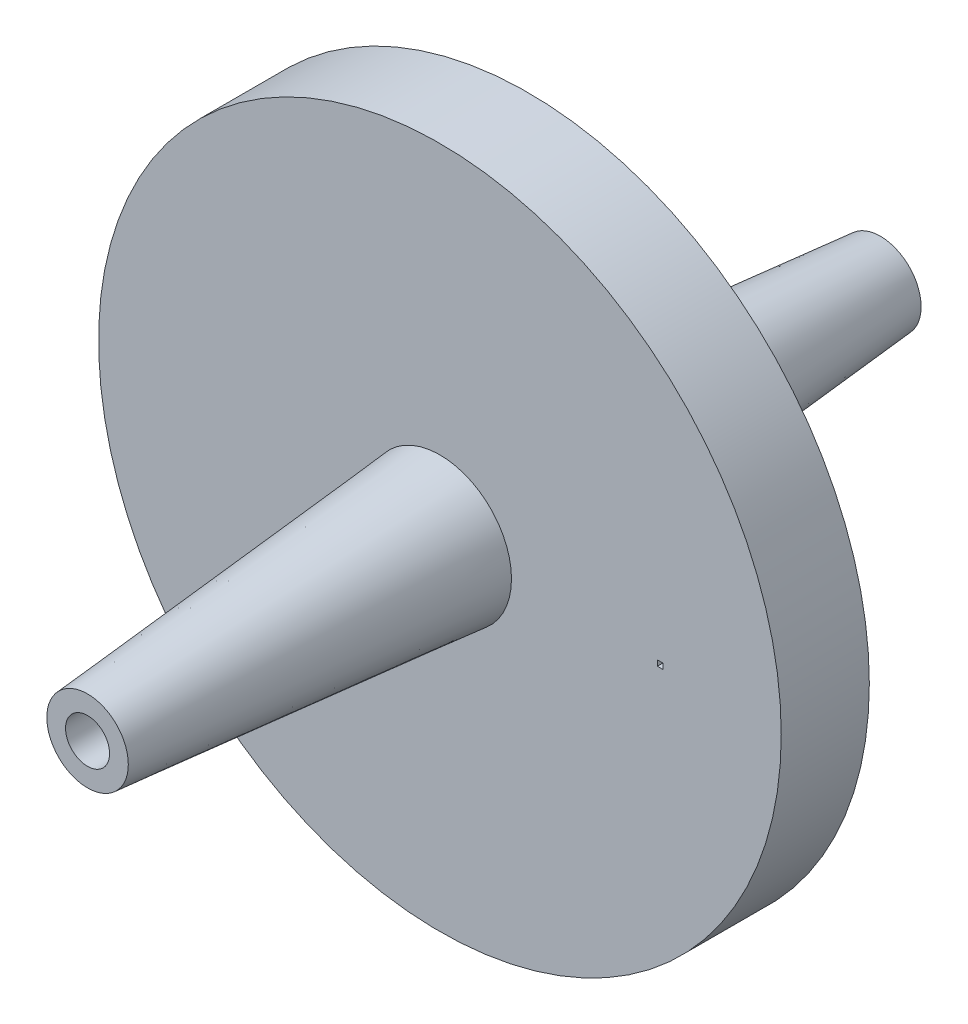
ISO-10303-21;
HEADER;
FILE_DESCRIPTION(('STEP AP214'),'2;1');
FILE_NAME('part.step','',(''),(''),'','','');
FILE_SCHEMA(('AUTOMOTIVE_DESIGN { 1 0 10303 214 1 1 1 1 }'));
ENDSEC;
DATA;
#1=APPLICATION_CONTEXT('core data for automotive mechanical design processes');
#2=APPLICATION_PROTOCOL_DEFINITION('international standard','automotive_design',2000,#1);
#3=PRODUCT_CONTEXT('',#1,'mechanical');
#4=PRODUCT('Part','Part','',(#3));
#5=PRODUCT_RELATED_PRODUCT_CATEGORY('part','',(#4));
#6=PRODUCT_DEFINITION_FORMATION('','',#4);
#7=PRODUCT_DEFINITION_CONTEXT('part definition',#1,'design');
#8=PRODUCT_DEFINITION('design','',#6,#7);
#9=PRODUCT_DEFINITION_SHAPE('','',#8);
#10=(LENGTH_UNIT() NAMED_UNIT(*) SI_UNIT(.MILLI.,.METRE.));
#11=(NAMED_UNIT(*) PLANE_ANGLE_UNIT() SI_UNIT($,.RADIAN.));
#12=(NAMED_UNIT(*) SI_UNIT($,.STERADIAN.) SOLID_ANGLE_UNIT());
#13=UNCERTAINTY_MEASURE_WITH_UNIT(LENGTH_MEASURE(1.E-05),#10,'distance_accuracy_value','');
#14=(GEOMETRIC_REPRESENTATION_CONTEXT(3) GLOBAL_UNCERTAINTY_ASSIGNED_CONTEXT((#13)) GLOBAL_UNIT_ASSIGNED_CONTEXT((#10,
#11,#12)) REPRESENTATION_CONTEXT('',''));
#15=CARTESIAN_POINT('',(0.,0.,0.));
#16=DIRECTION('',(0.,0.,1.));
#17=DIRECTION('',(1.,0.,0.));
#18=AXIS2_PLACEMENT_3D('',#15,#16,#17);
#19=CARTESIAN_POINT('',(0.,0.,4.));
#20=DIRECTION('',(0.,0.,-1.));
#21=DIRECTION('',(-1.,0.,0.));
#22=AXIS2_PLACEMENT_3D('',#19,#20,#21);
#23=CYLINDRICAL_SURFACE('',#22,31.);
#24=CARTESIAN_POINT('',(0.,0.,4.));
#25=DIRECTION('',(0.,0.,1.));
#26=DIRECTION('',(1.,0.,0.));
#27=AXIS2_PLACEMENT_3D('',#24,#25,#26);
#28=CIRCLE('',#27,31.);
#29=CARTESIAN_POINT('',(31.,0.,4.));
#30=VERTEX_POINT('',#29);
#31=EDGE_CURVE('E41',#30,#30,#28,.T.);
#32=ORIENTED_EDGE('',*,*,#31,.F.);
#33=EDGE_LOOP('',(#32));
#34=FACE_BOUND('',#33,.T.);
#35=CARTESIAN_POINT('',(0.,0.,-4.));
#36=DIRECTION('',(0.,0.,1.));
#37=DIRECTION('',(1.,0.,0.));
#38=AXIS2_PLACEMENT_3D('',#35,#36,#37);
#39=CIRCLE('',#38,31.);
#40=CARTESIAN_POINT('',(31.,0.,-4.));
#41=VERTEX_POINT('',#40);
#42=EDGE_CURVE('E36',#41,#41,#39,.T.);
#43=ORIENTED_EDGE('',*,*,#42,.T.);
#44=EDGE_LOOP('',(#43));
#45=FACE_BOUND('',#44,.T.);
#46=ADVANCED_FACE('F33',(#34,#45),#23,.T.);
#47=CARTESIAN_POINT('',(0.,0.,4.));
#48=DIRECTION('',(0.,0.,1.));
#49=DIRECTION('',(1.,0.,0.));
#50=AXIS2_PLACEMENT_3D('',#47,#48,#49);
#51=PLANE('',#50);
#52=DIRECTION('',(0.,1.,0.));
#53=VECTOR('',#52,1.);
#54=CARTESIAN_POINT('',(20.25,0.249999999999999,4.));
#55=LINE('',#54,#53);
#56=CARTESIAN_POINT('',(20.25,-0.250000000000001,4.));
#57=VERTEX_POINT('',#56);
#58=CARTESIAN_POINT('',(20.25,0.249999999999999,4.));
#59=VERTEX_POINT('',#58);
#60=EDGE_CURVE('E49',#57,#59,#55,.T.);
#61=ORIENTED_EDGE('',*,*,#60,.F.);
#62=DIRECTION('',(1.,0.,0.));
#63=VECTOR('',#62,1.);
#64=CARTESIAN_POINT('',(19.75,-0.250000000000001,4.));
#65=LINE('',#64,#63);
#66=CARTESIAN_POINT('',(19.75,-0.250000000000001,4.));
#67=VERTEX_POINT('',#66);
#68=EDGE_CURVE('E100',#67,#57,#65,.T.);
#69=ORIENTED_EDGE('',*,*,#68,.F.);
#70=DIRECTION('',(0.,-1.,0.));
#71=VECTOR('',#70,1.);
#72=CARTESIAN_POINT('',(19.75,0.249999999999999,4.));
#73=LINE('',#72,#71);
#74=CARTESIAN_POINT('',(19.75,0.249999999999999,4.));
#75=VERTEX_POINT('',#74);
#76=EDGE_CURVE('E106',#75,#67,#73,.T.);
#77=ORIENTED_EDGE('',*,*,#76,.F.);
#78=DIRECTION('',(-1.,0.,0.));
#79=VECTOR('',#78,1.);
#80=CARTESIAN_POINT('',(19.75,0.249999999999999,4.));
#81=LINE('',#80,#79);
#82=EDGE_CURVE('E84',#59,#75,#81,.T.);
#83=ORIENTED_EDGE('',*,*,#82,.F.);
#84=EDGE_LOOP('',(#61,#69,#77,#83));
#85=FACE_BOUND('',#84,.T.);
#86=CARTESIAN_POINT('',(0.,0.,4.));
#87=DIRECTION('',(0.,0.,1.));
#88=DIRECTION('',(1.,0.,0.));
#89=AXIS2_PLACEMENT_3D('',#86,#87,#88);
#90=CIRCLE('',#89,6.5);
#91=CARTESIAN_POINT('',(6.5,0.,4.));
#92=VERTEX_POINT('',#91);
#93=EDGE_CURVE('E11',#92,#92,#90,.T.);
#94=ORIENTED_EDGE('',*,*,#93,.F.);
#95=EDGE_LOOP('',(#94));
#96=FACE_BOUND('',#95,.T.);
#97=ORIENTED_EDGE('',*,*,#31,.T.);
#98=EDGE_LOOP('',(#97));
#99=FACE_BOUND('',#98,.T.);
#100=ADVANCED_FACE('F136',(#85,#96,#99),#51,.T.);
#101=CARTESIAN_POINT('',(0.,0.,-4.));
#102=DIRECTION('',(0.,0.,1.));
#103=DIRECTION('',(1.,0.,0.));
#104=AXIS2_PLACEMENT_3D('',#101,#102,#103);
#105=PLANE('',#104);
#106=CARTESIAN_POINT('',(0.,0.,-4.));
#107=DIRECTION('',(0.,0.,1.));
#108=DIRECTION('',(1.,0.,0.));
#109=AXIS2_PLACEMENT_3D('',#106,#107,#108);
#110=CIRCLE('',#109,6.5);
#111=CARTESIAN_POINT('',(6.5,0.,-4.));
#112=VERTEX_POINT('',#111);
#113=EDGE_CURVE('E116',#112,#112,#110,.T.);
#114=ORIENTED_EDGE('',*,*,#113,.T.);
#115=EDGE_LOOP('',(#114));
#116=FACE_BOUND('',#115,.T.);
#117=ORIENTED_EDGE('',*,*,#42,.F.);
#118=EDGE_LOOP('',(#117));
#119=FACE_BOUND('',#118,.T.);
#120=ADVANCED_FACE('F133',(#116,#119),#105,.F.);
#121=CARTESIAN_POINT('',(0.,0.,4.));
#122=DIRECTION('',(0.,0.,-1.));
#123=DIRECTION('',(1.,0.,0.));
#124=AXIS2_PLACEMENT_3D('',#121,#122,#123);
#125=CONICAL_SURFACE('',#124,6.5,0.0872664625997165);
#126=CARTESIAN_POINT('',(0.,0.,36.));
#127=DIRECTION('',(0.,0.,1.));
#128=DIRECTION('',(1.,0.,0.));
#129=AXIS2_PLACEMENT_3D('',#126,#127,#128);
#130=CIRCLE('',#129,3.70036276717043);
#131=CARTESIAN_POINT('',(3.70036276717043,0.,36.));
#132=VERTEX_POINT('',#131);
#133=EDGE_CURVE('E123',#132,#132,#130,.T.);
#134=ORIENTED_EDGE('',*,*,#133,.F.);
#135=EDGE_LOOP('',(#134));
#136=FACE_BOUND('',#135,.T.);
#137=ORIENTED_EDGE('',*,*,#93,.T.);
#138=EDGE_LOOP('',(#137));
#139=FACE_BOUND('',#138,.T.);
#140=ADVANCED_FACE('F135',(#136,#139),#125,.T.);
#141=CARTESIAN_POINT('',(0.,0.,36.));
#142=DIRECTION('',(0.,0.,1.));
#143=DIRECTION('',(1.,0.,0.));
#144=AXIS2_PLACEMENT_3D('',#141,#142,#143);
#145=PLANE('',#144);
#146=CARTESIAN_POINT('',(0.,0.,36.));
#147=DIRECTION('',(0.,0.,1.));
#148=DIRECTION('',(1.,0.,0.));
#149=AXIS2_PLACEMENT_3D('',#146,#147,#148);
#150=CIRCLE('',#149,2.);
#151=CARTESIAN_POINT('',(2.,0.,36.));
#152=VERTEX_POINT('',#151);
#153=EDGE_CURVE('E110',#152,#152,#150,.T.);
#154=ORIENTED_EDGE('',*,*,#153,.F.);
#155=EDGE_LOOP('',(#154));
#156=FACE_BOUND('',#155,.T.);
#157=ORIENTED_EDGE('',*,*,#133,.T.);
#158=EDGE_LOOP('',(#157));
#159=FACE_BOUND('',#158,.T.);
#160=ADVANCED_FACE('F142',(#156,#159),#145,.T.);
#161=CARTESIAN_POINT('',(0.,0.,-4.));
#162=DIRECTION('',(0.,0.,1.));
#163=DIRECTION('',(1.,0.,0.));
#164=AXIS2_PLACEMENT_3D('',#161,#162,#163);
#165=CONICAL_SURFACE('',#164,6.5,0.0872664625997165);
#166=CARTESIAN_POINT('',(0.,0.,-36.));
#167=DIRECTION('',(0.,0.,-1.));
#168=DIRECTION('',(-1.,0.,0.));
#169=AXIS2_PLACEMENT_3D('',#166,#167,#168);
#170=CIRCLE('',#169,3.70036276717043);
#171=CARTESIAN_POINT('',(-3.70036276717043,0.,-36.));
#172=VERTEX_POINT('',#171);
#173=EDGE_CURVE('E121',#172,#172,#170,.F.);
#174=ORIENTED_EDGE('',*,*,#173,.T.);
#175=EDGE_LOOP('',(#174));
#176=FACE_BOUND('',#175,.T.);
#177=ORIENTED_EDGE('',*,*,#113,.F.);
#178=EDGE_LOOP('',(#177));
#179=FACE_BOUND('',#178,.T.);
#180=ADVANCED_FACE('F214',(#176,#179),#165,.T.);
#181=CARTESIAN_POINT('',(0.,0.,-36.));
#182=DIRECTION('',(0.,0.,-1.));
#183=DIRECTION('',(1.,0.,0.));
#184=AXIS2_PLACEMENT_3D('',#181,#182,#183);
#185=PLANE('',#184);
#186=CARTESIAN_POINT('',(0.,0.,-36.));
#187=DIRECTION('',(0.,0.,1.));
#188=DIRECTION('',(1.,0.,0.));
#189=AXIS2_PLACEMENT_3D('',#186,#187,#188);
#190=CIRCLE('',#189,2.);
#191=CARTESIAN_POINT('',(2.,0.,-36.));
#192=VERTEX_POINT('',#191);
#193=EDGE_CURVE('E113',#192,#192,#190,.T.);
#194=ORIENTED_EDGE('',*,*,#193,.T.);
#195=EDGE_LOOP('',(#194));
#196=FACE_BOUND('',#195,.T.);
#197=ORIENTED_EDGE('',*,*,#173,.F.);
#198=EDGE_LOOP('',(#197));
#199=FACE_BOUND('',#198,.T.);
#200=ADVANCED_FACE('F211',(#196,#199),#185,.T.);
#201=CARTESIAN_POINT('',(0.,0.,-36.));
#202=DIRECTION('',(0.,0.,1.));
#203=DIRECTION('',(1.,0.,0.));
#204=AXIS2_PLACEMENT_3D('',#201,#202,#203);
#205=CYLINDRICAL_SURFACE('',#204,2.);
#206=ORIENTED_EDGE('',*,*,#193,.F.);
#207=EDGE_LOOP('',(#206));
#208=FACE_BOUND('',#207,.T.);
#209=ORIENTED_EDGE('',*,*,#153,.T.);
#210=EDGE_LOOP('',(#209));
#211=FACE_BOUND('',#210,.T.);
#212=ADVANCED_FACE('F163',(#208,#211),#205,.F.);
#213=CARTESIAN_POINT('',(20.25,0.249999999999999,3.5));
#214=DIRECTION('',(1.,0.,0.));
#215=DIRECTION('',(0.,0.,-1.));
#216=AXIS2_PLACEMENT_3D('',#213,#214,#215);
#217=PLANE('',#216);
#218=ORIENTED_EDGE('',*,*,#60,.T.);
#219=DIRECTION('',(0.,0.,1.));
#220=VECTOR('',#219,1.);
#221=CARTESIAN_POINT('',(20.25,0.249999999999999,3.5));
#222=LINE('',#221,#220);
#223=CARTESIAN_POINT('',(20.25,0.249999999999999,3.5));
#224=VERTEX_POINT('',#223);
#225=EDGE_CURVE('E72',#224,#59,#222,.T.);
#226=ORIENTED_EDGE('',*,*,#225,.F.);
#227=DIRECTION('',(0.,1.,0.));
#228=VECTOR('',#227,1.);
#229=CARTESIAN_POINT('',(20.25,0.249999999999999,3.5));
#230=LINE('',#229,#228);
#231=CARTESIAN_POINT('',(20.25,-0.250000000000001,3.5));
#232=VERTEX_POINT('',#231);
#233=EDGE_CURVE('E98',#232,#224,#230,.T.);
#234=ORIENTED_EDGE('',*,*,#233,.F.);
#235=DIRECTION('',(0.,0.,1.));
#236=VECTOR('',#235,1.);
#237=CARTESIAN_POINT('',(20.25,-0.250000000000001,3.5));
#238=LINE('',#237,#236);
#239=EDGE_CURVE('E57',#232,#57,#238,.T.);
#240=ORIENTED_EDGE('',*,*,#239,.T.);
#241=EDGE_LOOP('',(#218,#226,#234,#240));
#242=FACE_BOUND('',#241,.T.);
#243=ADVANCED_FACE('F168',(#242),#217,.F.);
#244=CARTESIAN_POINT('',(19.75,-0.250000000000001,3.5));
#245=DIRECTION('',(0.,-1.,0.));
#246=DIRECTION('',(1.,0.,0.));
#247=AXIS2_PLACEMENT_3D('',#244,#245,#246);
#248=PLANE('',#247);
#249=ORIENTED_EDGE('',*,*,#68,.T.);
#250=ORIENTED_EDGE('',*,*,#239,.F.);
#251=DIRECTION('',(1.,0.,0.));
#252=VECTOR('',#251,1.);
#253=CARTESIAN_POINT('',(19.75,-0.250000000000001,3.5));
#254=LINE('',#253,#252);
#255=CARTESIAN_POINT('',(19.75,-0.250000000000001,3.5));
#256=VERTEX_POINT('',#255);
#257=EDGE_CURVE('E95',#256,#232,#254,.T.);
#258=ORIENTED_EDGE('',*,*,#257,.F.);
#259=DIRECTION('',(0.,0.,1.));
#260=VECTOR('',#259,1.);
#261=CARTESIAN_POINT('',(19.75,-0.250000000000001,3.5));
#262=LINE('',#261,#260);
#263=EDGE_CURVE('E88',#256,#67,#262,.T.);
#264=ORIENTED_EDGE('',*,*,#263,.T.);
#265=EDGE_LOOP('',(#249,#250,#258,#264));
#266=FACE_BOUND('',#265,.T.);
#267=ADVANCED_FACE('F173',(#266),#248,.F.);
#268=CARTESIAN_POINT('',(19.75,0.249999999999999,3.5));
#269=DIRECTION('',(-1.,0.,0.));
#270=DIRECTION('',(0.,0.,1.));
#271=AXIS2_PLACEMENT_3D('',#268,#269,#270);
#272=PLANE('',#271);
#273=ORIENTED_EDGE('',*,*,#76,.T.);
#274=ORIENTED_EDGE('',*,*,#263,.F.);
#275=DIRECTION('',(0.,-1.,0.));
#276=VECTOR('',#275,1.);
#277=CARTESIAN_POINT('',(19.75,0.249999999999999,3.5));
#278=LINE('',#277,#276);
#279=CARTESIAN_POINT('',(19.75,0.249999999999999,3.5));
#280=VERTEX_POINT('',#279);
#281=EDGE_CURVE('E91',#280,#256,#278,.T.);
#282=ORIENTED_EDGE('',*,*,#281,.F.);
#283=DIRECTION('',(0.,0.,1.));
#284=VECTOR('',#283,1.);
#285=CARTESIAN_POINT('',(19.75,0.249999999999999,3.5));
#286=LINE('',#285,#284);
#287=EDGE_CURVE('E77',#280,#75,#286,.T.);
#288=ORIENTED_EDGE('',*,*,#287,.T.);
#289=EDGE_LOOP('',(#273,#274,#282,#288));
#290=FACE_BOUND('',#289,.T.);
#291=ADVANCED_FACE('F92',(#290),#272,.F.);
#292=CARTESIAN_POINT('',(19.75,0.249999999999999,3.5));
#293=DIRECTION('',(0.,1.,0.));
#294=DIRECTION('',(0.,0.,1.));
#295=AXIS2_PLACEMENT_3D('',#292,#293,#294);
#296=PLANE('',#295);
#297=ORIENTED_EDGE('',*,*,#82,.T.);
#298=ORIENTED_EDGE('',*,*,#287,.F.);
#299=DIRECTION('',(-1.,0.,0.));
#300=VECTOR('',#299,1.);
#301=CARTESIAN_POINT('',(19.75,0.249999999999999,3.5));
#302=LINE('',#301,#300);
#303=EDGE_CURVE('E81',#224,#280,#302,.T.);
#304=ORIENTED_EDGE('',*,*,#303,.F.);
#305=ORIENTED_EDGE('',*,*,#225,.T.);
#306=EDGE_LOOP('',(#297,#298,#304,#305));
#307=FACE_BOUND('',#306,.T.);
#308=ADVANCED_FACE('F79',(#307),#296,.F.);
#309=CARTESIAN_POINT('',(0.,0.,3.5));
#310=DIRECTION('',(0.,0.,1.));
#311=DIRECTION('',(1.,0.,0.));
#312=AXIS2_PLACEMENT_3D('',#309,#310,#311);
#313=PLANE('',#312);
#314=ORIENTED_EDGE('',*,*,#233,.T.);
#315=ORIENTED_EDGE('',*,*,#303,.T.);
#316=ORIENTED_EDGE('',*,*,#281,.T.);
#317=ORIENTED_EDGE('',*,*,#257,.T.);
#318=EDGE_LOOP('',(#314,#315,#316,#317));
#319=FACE_BOUND('',#318,.T.);
#320=ADVANCED_FACE('F97',(#319),#313,.T.);
#321=CLOSED_SHELL('',(#46,#100,#120,#140,#160,#180,#200,#212,#243,#267,#291,#308,#320));
#322=MANIFOLD_SOLID_BREP('B2',#321);
#323=ADVANCED_BREP_SHAPE_REPRESENTATION('',(#18,#322),#14);
#324=SHAPE_DEFINITION_REPRESENTATION(#9,#323);
ENDSEC;
END-ISO-10303-21;
